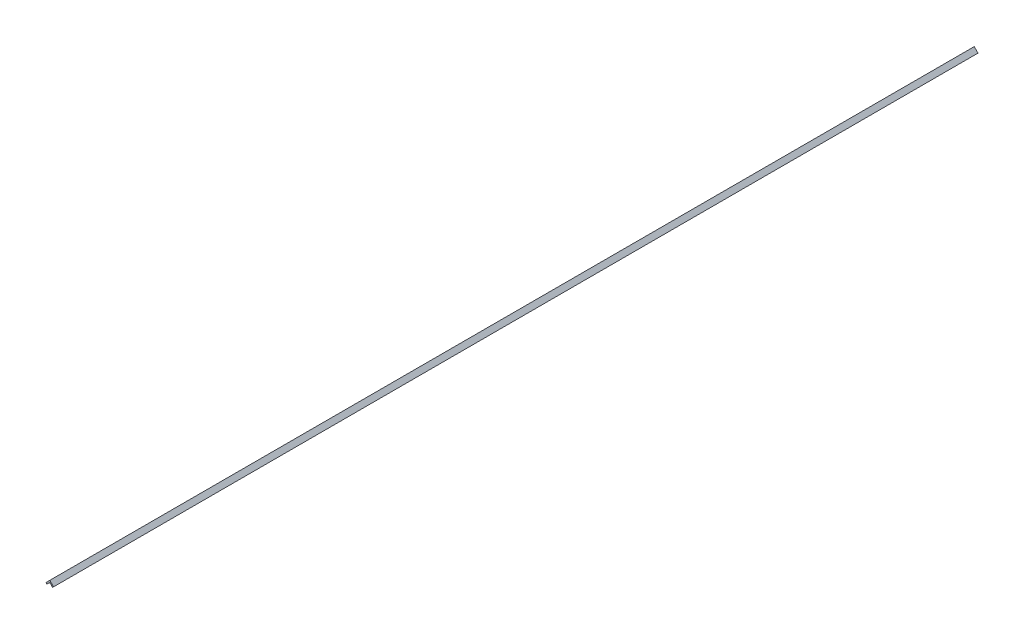
ISO-10303-21;
HEADER;
FILE_DESCRIPTION(('STEP AP214'),'2;1');
FILE_NAME('part.step','',(''),(''),'','','');
FILE_SCHEMA(('AUTOMOTIVE_DESIGN { 1 0 10303 214 1 1 1 1 }'));
ENDSEC;
DATA;
#1=APPLICATION_CONTEXT('core data for automotive mechanical design processes');
#2=APPLICATION_PROTOCOL_DEFINITION('international standard','automotive_design',2000,#1);
#3=PRODUCT_CONTEXT('',#1,'mechanical');
#4=PRODUCT('Part','Part','',(#3));
#5=PRODUCT_RELATED_PRODUCT_CATEGORY('part','',(#4));
#6=PRODUCT_DEFINITION_FORMATION('','',#4);
#7=PRODUCT_DEFINITION_CONTEXT('part definition',#1,'design');
#8=PRODUCT_DEFINITION('design','',#6,#7);
#9=PRODUCT_DEFINITION_SHAPE('','',#8);
#10=(LENGTH_UNIT() NAMED_UNIT(*) SI_UNIT(.MILLI.,.METRE.));
#11=(NAMED_UNIT(*) PLANE_ANGLE_UNIT() SI_UNIT($,.RADIAN.));
#12=(NAMED_UNIT(*) SI_UNIT($,.STERADIAN.) SOLID_ANGLE_UNIT());
#13=UNCERTAINTY_MEASURE_WITH_UNIT(LENGTH_MEASURE(1.E-05),#10,'distance_accuracy_value','');
#14=(GEOMETRIC_REPRESENTATION_CONTEXT(3) GLOBAL_UNCERTAINTY_ASSIGNED_CONTEXT((#13)) GLOBAL_UNIT_ASSIGNED_CONTEXT((#10,
#11,#12)) REPRESENTATION_CONTEXT('',''));
#15=CARTESIAN_POINT('',(0.,0.,0.));
#16=DIRECTION('',(0.,0.,1.));
#17=DIRECTION('',(1.,0.,0.));
#18=AXIS2_PLACEMENT_3D('',#15,#16,#17);
#19=CARTESIAN_POINT('',(0.,11.2288556852424,2200.));
#20=DIRECTION('',(0.707106781186548,-0.707106781186548,0.));
#21=DIRECTION('',(0.707106781186548,0.707106781186548,0.));
#22=AXIS2_PLACEMENT_3D('',#19,#20,#21);
#23=PLANE('',#22);
#24=DIRECTION('',(-0.707106781186548,-0.707106781186547,0.));
#25=VECTOR('',#24,1.);
#26=CARTESIAN_POINT('',(0.,11.2288556852424,0.));
#27=LINE('',#26,#25);
#28=CARTESIAN_POINT('',(0.,11.2288556852424,0.));
#29=VERTEX_POINT('',#28);
#30=CARTESIAN_POINT('',(-8.98025612106915,2.24859956417322,0.));
#31=VERTEX_POINT('',#30);
#32=EDGE_CURVE('E119',#29,#31,#27,.T.);
#33=ORIENTED_EDGE('',*,*,#32,.T.);
#34=DIRECTION('',(0.,0.,-1.));
#35=VECTOR('',#34,1.);
#36=CARTESIAN_POINT('',(-8.98025612106915,2.24859956417322,2200.));
#37=LINE('',#36,#35);
#38=CARTESIAN_POINT('',(-8.98025612106915,2.24859956417322,2200.));
#39=VERTEX_POINT('',#38);
#40=EDGE_CURVE('E11',#39,#31,#37,.T.);
#41=ORIENTED_EDGE('',*,*,#40,.F.);
#42=DIRECTION('',(-0.707106781186548,-0.707106781186547,0.));
#43=VECTOR('',#42,1.);
#44=CARTESIAN_POINT('',(0.,11.2288556852424,2200.));
#45=LINE('',#44,#43);
#46=CARTESIAN_POINT('',(0.,11.2288556852424,2200.));
#47=VERTEX_POINT('',#46);
#48=EDGE_CURVE('E129',#47,#39,#45,.T.);
#49=ORIENTED_EDGE('',*,*,#48,.F.);
#50=DIRECTION('',(0.,0.,-1.));
#51=VECTOR('',#50,1.);
#52=CARTESIAN_POINT('',(0.,11.2288556852424,2200.));
#53=LINE('',#52,#51);
#54=EDGE_CURVE('E115',#47,#29,#53,.T.);
#55=ORIENTED_EDGE('',*,*,#54,.T.);
#56=EDGE_LOOP('',(#33,#41,#49,#55));
#57=FACE_BOUND('',#56,.T.);
#58=ADVANCED_FACE('F35',(#57),#23,.F.);
#59=CARTESIAN_POINT('',(-8.98025612106915,2.24859956417322,2200.));
#60=DIRECTION('',(0.707106781186548,0.707106781186547,0.));
#61=DIRECTION('',(-0.707106781186547,0.707106781186548,0.));
#62=AXIS2_PLACEMENT_3D('',#59,#60,#61);
#63=PLANE('',#62);
#64=DIRECTION('',(0.707106781186547,-0.707106781186548,0.));
#65=VECTOR('',#64,1.);
#66=CARTESIAN_POINT('',(-8.98025612106915,2.24859956417322,0.));
#67=LINE('',#66,#65);
#68=CARTESIAN_POINT('',(-6.73165655689593,0.,0.));
#69=VERTEX_POINT('',#68);
#70=EDGE_CURVE('E122',#31,#69,#67,.T.);
#71=ORIENTED_EDGE('',*,*,#70,.T.);
#72=DIRECTION('',(0.,0.,-1.));
#73=VECTOR('',#72,1.);
#74=CARTESIAN_POINT('',(-6.73165655689593,0.,2200.));
#75=LINE('',#74,#73);
#76=CARTESIAN_POINT('',(-6.73165655689593,0.,2200.));
#77=VERTEX_POINT('',#76);
#78=EDGE_CURVE('E43',#77,#69,#75,.T.);
#79=ORIENTED_EDGE('',*,*,#78,.F.);
#80=DIRECTION('',(0.707106781186547,-0.707106781186548,0.));
#81=VECTOR('',#80,1.);
#82=CARTESIAN_POINT('',(-8.98025612106915,2.24859956417322,2200.));
#83=LINE('',#82,#81);
#84=EDGE_CURVE('E88',#39,#77,#83,.T.);
#85=ORIENTED_EDGE('',*,*,#84,.F.);
#86=ORIENTED_EDGE('',*,*,#40,.T.);
#87=EDGE_LOOP('',(#71,#79,#85,#86));
#88=FACE_BOUND('',#87,.T.);
#89=ADVANCED_FACE('F153',(#88),#63,.F.);
#90=CARTESIAN_POINT('',(-6.73165655689593,0.,2200.));
#91=DIRECTION('',(-0.707106781186548,0.707106781186547,0.));
#92=DIRECTION('',(-0.707106781186547,-0.707106781186548,0.));
#93=AXIS2_PLACEMENT_3D('',#90,#91,#92);
#94=PLANE('',#93);
#95=DIRECTION('',(0.707106781186547,0.707106781186548,0.));
#96=VECTOR('',#95,1.);
#97=CARTESIAN_POINT('',(-6.73165655689593,0.,0.));
#98=LINE('',#97,#96);
#99=CARTESIAN_POINT('',(0.,6.73165655689594,0.));
#100=VERTEX_POINT('',#99);
#101=EDGE_CURVE('E124',#69,#100,#98,.T.);
#102=ORIENTED_EDGE('',*,*,#101,.T.);
#103=DIRECTION('',(0.,0.,-1.));
#104=VECTOR('',#103,1.);
#105=CARTESIAN_POINT('',(0.,6.73165655689594,2200.));
#106=LINE('',#105,#104);
#107=CARTESIAN_POINT('',(0.,6.73165655689594,2200.));
#108=VERTEX_POINT('',#107);
#109=EDGE_CURVE('E110',#108,#100,#106,.T.);
#110=ORIENTED_EDGE('',*,*,#109,.F.);
#111=DIRECTION('',(0.707106781186547,0.707106781186548,0.));
#112=VECTOR('',#111,1.);
#113=CARTESIAN_POINT('',(-6.73165655689593,0.,2200.));
#114=LINE('',#113,#112);
#115=EDGE_CURVE('E101',#77,#108,#114,.T.);
#116=ORIENTED_EDGE('',*,*,#115,.F.);
#117=ORIENTED_EDGE('',*,*,#78,.T.);
#118=EDGE_LOOP('',(#102,#110,#116,#117));
#119=FACE_BOUND('',#118,.T.);
#120=ADVANCED_FACE('F135',(#119),#94,.F.);
#121=CARTESIAN_POINT('',(6.73165655689597,0.,2200.));
#122=DIRECTION('',(0.707106781186545,0.70710678118655,0.));
#123=DIRECTION('',(-0.70710678118655,0.707106781186545,0.));
#124=AXIS2_PLACEMENT_3D('',#121,#122,#123);
#125=PLANE('',#124);
#126=DIRECTION('',(0.70710678118655,-0.707106781186545,0.));
#127=VECTOR('',#126,1.);
#128=CARTESIAN_POINT('',(6.73165655689597,0.,0.));
#129=LINE('',#128,#127);
#130=CARTESIAN_POINT('',(6.73165655689597,0.,0.));
#131=VERTEX_POINT('',#130);
#132=EDGE_CURVE('E109',#100,#131,#129,.T.);
#133=ORIENTED_EDGE('',*,*,#132,.T.);
#134=DIRECTION('',(0.,0.,-1.));
#135=VECTOR('',#134,1.);
#136=CARTESIAN_POINT('',(6.73165655689597,0.,2200.));
#137=LINE('',#136,#135);
#138=CARTESIAN_POINT('',(6.73165655689597,0.,2200.));
#139=VERTEX_POINT('',#138);
#140=EDGE_CURVE('E106',#139,#131,#137,.T.);
#141=ORIENTED_EDGE('',*,*,#140,.F.);
#142=DIRECTION('',(0.70710678118655,-0.707106781186545,0.));
#143=VECTOR('',#142,1.);
#144=CARTESIAN_POINT('',(6.73165655689597,0.,2200.));
#145=LINE('',#144,#143);
#146=EDGE_CURVE('E95',#108,#139,#145,.T.);
#147=ORIENTED_EDGE('',*,*,#146,.F.);
#148=ORIENTED_EDGE('',*,*,#109,.T.);
#149=EDGE_LOOP('',(#133,#141,#147,#148));
#150=FACE_BOUND('',#149,.T.);
#151=ADVANCED_FACE('F107',(#150),#125,.F.);
#152=CARTESIAN_POINT('',(8.98025612106918,2.24859956417325,2200.));
#153=DIRECTION('',(-0.70710678118655,0.707106781186545,0.));
#154=DIRECTION('',(-0.707106781186545,-0.70710678118655,0.));
#155=AXIS2_PLACEMENT_3D('',#152,#153,#154);
#156=PLANE('',#155);
#157=DIRECTION('',(0.707106781186545,0.70710678118655,0.));
#158=VECTOR('',#157,1.);
#159=CARTESIAN_POINT('',(8.98025612106918,2.24859956417325,0.));
#160=LINE('',#159,#158);
#161=CARTESIAN_POINT('',(8.98025612106918,2.24859956417325,0.));
#162=VERTEX_POINT('',#161);
#163=EDGE_CURVE('E74',#131,#162,#160,.T.);
#164=ORIENTED_EDGE('',*,*,#163,.T.);
#165=DIRECTION('',(0.,0.,-1.));
#166=VECTOR('',#165,1.);
#167=CARTESIAN_POINT('',(8.98025612106918,2.24859956417325,2200.));
#168=LINE('',#167,#166);
#169=CARTESIAN_POINT('',(8.98025612106918,2.24859956417325,2200.));
#170=VERTEX_POINT('',#169);
#171=EDGE_CURVE('E111',#170,#162,#168,.T.);
#172=ORIENTED_EDGE('',*,*,#171,.F.);
#173=DIRECTION('',(0.707106781186545,0.70710678118655,0.));
#174=VECTOR('',#173,1.);
#175=CARTESIAN_POINT('',(8.98025612106918,2.24859956417325,2200.));
#176=LINE('',#175,#174);
#177=EDGE_CURVE('E99',#139,#170,#176,.T.);
#178=ORIENTED_EDGE('',*,*,#177,.F.);
#179=ORIENTED_EDGE('',*,*,#140,.T.);
#180=EDGE_LOOP('',(#164,#172,#178,#179));
#181=FACE_BOUND('',#180,.T.);
#182=ADVANCED_FACE('F113',(#181),#156,.F.);
#183=CARTESIAN_POINT('',(0.,11.2288556852424,2200.));
#184=DIRECTION('',(-0.707106781186545,-0.70710678118655,0.));
#185=DIRECTION('',(0.70710678118655,-0.707106781186545,0.));
#186=AXIS2_PLACEMENT_3D('',#183,#184,#185);
#187=PLANE('',#186);
#188=DIRECTION('',(-0.70710678118655,0.707106781186545,0.));
#189=VECTOR('',#188,1.);
#190=CARTESIAN_POINT('',(0.,11.2288556852424,0.));
#191=LINE('',#190,#189);
#192=EDGE_CURVE('E80',#162,#29,#191,.T.);
#193=ORIENTED_EDGE('',*,*,#192,.T.);
#194=ORIENTED_EDGE('',*,*,#54,.F.);
#195=DIRECTION('',(-0.70710678118655,0.707106781186545,0.));
#196=VECTOR('',#195,1.);
#197=CARTESIAN_POINT('',(0.,11.2288556852424,2200.));
#198=LINE('',#197,#196);
#199=EDGE_CURVE('E51',#170,#47,#198,.T.);
#200=ORIENTED_EDGE('',*,*,#199,.F.);
#201=ORIENTED_EDGE('',*,*,#171,.T.);
#202=EDGE_LOOP('',(#193,#194,#200,#201));
#203=FACE_BOUND('',#202,.T.);
#204=ADVANCED_FACE('F142',(#203),#187,.F.);
#205=CARTESIAN_POINT('',(0.,0.,2200.));
#206=DIRECTION('',(0.,0.,1.));
#207=DIRECTION('',(1.,0.,0.));
#208=AXIS2_PLACEMENT_3D('',#205,#206,#207);
#209=PLANE('',#208);
#210=ORIENTED_EDGE('',*,*,#48,.T.);
#211=ORIENTED_EDGE('',*,*,#84,.T.);
#212=ORIENTED_EDGE('',*,*,#115,.T.);
#213=ORIENTED_EDGE('',*,*,#146,.T.);
#214=ORIENTED_EDGE('',*,*,#177,.T.);
#215=ORIENTED_EDGE('',*,*,#199,.T.);
#216=EDGE_LOOP('',(#210,#211,#212,#213,#214,#215));
#217=FACE_BOUND('',#216,.T.);
#218=ADVANCED_FACE('F97',(#217),#209,.T.);
#219=CARTESIAN_POINT('',(0.,0.,0.));
#220=DIRECTION('',(0.,0.,1.));
#221=DIRECTION('',(1.,0.,0.));
#222=AXIS2_PLACEMENT_3D('',#219,#220,#221);
#223=PLANE('',#222);
#224=ORIENTED_EDGE('',*,*,#32,.F.);
#225=ORIENTED_EDGE('',*,*,#192,.F.);
#226=ORIENTED_EDGE('',*,*,#163,.F.);
#227=ORIENTED_EDGE('',*,*,#132,.F.);
#228=ORIENTED_EDGE('',*,*,#101,.F.);
#229=ORIENTED_EDGE('',*,*,#70,.F.);
#230=EDGE_LOOP('',(#224,#225,#226,#227,#228,#229));
#231=FACE_BOUND('',#230,.T.);
#232=ADVANCED_FACE('F138',(#231),#223,.F.);
#233=CLOSED_SHELL('',(#58,#89,#120,#151,#182,#204,#218,#232));
#234=MANIFOLD_SOLID_BREP('B2',#233);
#235=ADVANCED_BREP_SHAPE_REPRESENTATION('',(#18,#234),#14);
#236=SHAPE_DEFINITION_REPRESENTATION(#9,#235);
ENDSEC;
END-ISO-10303-21;
